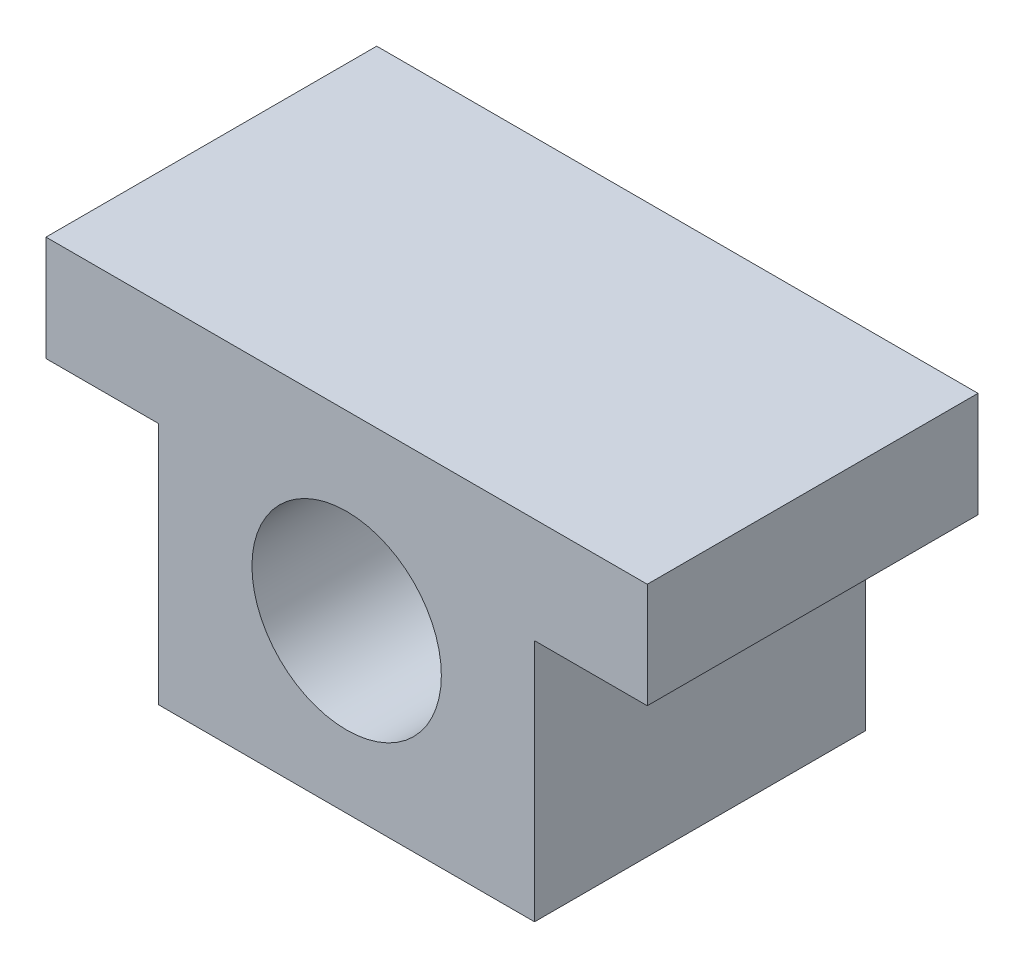
ISO-10303-21;
HEADER;
FILE_DESCRIPTION(('STEP AP214'),'2;1');
FILE_NAME('part.step','',(''),(''),'','','');
FILE_SCHEMA(('AUTOMOTIVE_DESIGN { 1 0 10303 214 1 1 1 1 }'));
ENDSEC;
DATA;
#1=APPLICATION_CONTEXT('core data for automotive mechanical design processes');
#2=APPLICATION_PROTOCOL_DEFINITION('international standard','automotive_design',2000,#1);
#3=PRODUCT_CONTEXT('',#1,'mechanical');
#4=PRODUCT('Part','Part','',(#3));
#5=PRODUCT_RELATED_PRODUCT_CATEGORY('part','',(#4));
#6=PRODUCT_DEFINITION_FORMATION('','',#4);
#7=PRODUCT_DEFINITION_CONTEXT('part definition',#1,'design');
#8=PRODUCT_DEFINITION('design','',#6,#7);
#9=PRODUCT_DEFINITION_SHAPE('','',#8);
#10=(LENGTH_UNIT() NAMED_UNIT(*) SI_UNIT(.MILLI.,.METRE.));
#11=(NAMED_UNIT(*) PLANE_ANGLE_UNIT() SI_UNIT($,.RADIAN.));
#12=(NAMED_UNIT(*) SI_UNIT($,.STERADIAN.) SOLID_ANGLE_UNIT());
#13=UNCERTAINTY_MEASURE_WITH_UNIT(LENGTH_MEASURE(1.E-05),#10,'distance_accuracy_value','');
#14=(GEOMETRIC_REPRESENTATION_CONTEXT(3) GLOBAL_UNCERTAINTY_ASSIGNED_CONTEXT((#13)) GLOBAL_UNIT_ASSIGNED_CONTEXT((#10,
#11,#12)) REPRESENTATION_CONTEXT('',''));
#15=CARTESIAN_POINT('',(0.,0.,0.));
#16=DIRECTION('',(0.,0.,1.));
#17=DIRECTION('',(1.,0.,0.));
#18=AXIS2_PLACEMENT_3D('',#15,#16,#17);
#19=CARTESIAN_POINT('',(100.,-17.5,110.));
#20=DIRECTION('',(-1.,0.,0.));
#21=DIRECTION('',(0.,0.,1.));
#22=AXIS2_PLACEMENT_3D('',#19,#20,#21);
#23=PLANE('',#22);
#24=DIRECTION('',(0.,1.,0.));
#25=VECTOR('',#24,1.);
#26=CARTESIAN_POINT('',(100.,-17.5,0.));
#27=LINE('',#26,#25);
#28=CARTESIAN_POINT('',(100.,-17.5,0.));
#29=VERTEX_POINT('',#28);
#30=CARTESIAN_POINT('',(100.,17.5,0.));
#31=VERTEX_POINT('',#30);
#32=EDGE_CURVE('E144',#29,#31,#27,.T.);
#33=ORIENTED_EDGE('',*,*,#32,.T.);
#34=DIRECTION('',(0.,0.,-1.));
#35=VECTOR('',#34,1.);
#36=CARTESIAN_POINT('',(100.,17.5,110.));
#37=LINE('',#36,#35);
#38=CARTESIAN_POINT('',(100.,17.5,110.));
#39=VERTEX_POINT('',#38);
#40=EDGE_CURVE('E11',#39,#31,#37,.T.);
#41=ORIENTED_EDGE('',*,*,#40,.F.);
#42=DIRECTION('',(0.,1.,0.));
#43=VECTOR('',#42,1.);
#44=CARTESIAN_POINT('',(100.,-17.5,110.));
#45=LINE('',#44,#43);
#46=CARTESIAN_POINT('',(100.,-17.5,110.));
#47=VERTEX_POINT('',#46);
#48=EDGE_CURVE('E159',#47,#39,#45,.T.);
#49=ORIENTED_EDGE('',*,*,#48,.F.);
#50=DIRECTION('',(0.,0.,-1.));
#51=VECTOR('',#50,1.);
#52=CARTESIAN_POINT('',(100.,-17.5,110.));
#53=LINE('',#52,#51);
#54=EDGE_CURVE('E140',#47,#29,#53,.T.);
#55=ORIENTED_EDGE('',*,*,#54,.T.);
#56=EDGE_LOOP('',(#33,#41,#49,#55));
#57=FACE_BOUND('',#56,.T.);
#58=ADVANCED_FACE('F45',(#57),#23,.F.);
#59=CARTESIAN_POINT('',(-100.,17.5,110.));
#60=DIRECTION('',(0.,-1.,0.));
#61=DIRECTION('',(0.,0.,-1.));
#62=AXIS2_PLACEMENT_3D('',#59,#60,#61);
#63=PLANE('',#62);
#64=DIRECTION('',(-1.,0.,0.));
#65=VECTOR('',#64,1.);
#66=CARTESIAN_POINT('',(-100.,17.5,0.));
#67=LINE('',#66,#65);
#68=CARTESIAN_POINT('',(-100.,17.5,0.));
#69=VERTEX_POINT('',#68);
#70=EDGE_CURVE('E147',#31,#69,#67,.T.);
#71=ORIENTED_EDGE('',*,*,#70,.T.);
#72=DIRECTION('',(0.,0.,-1.));
#73=VECTOR('',#72,1.);
#74=CARTESIAN_POINT('',(-100.,17.5,110.));
#75=LINE('',#74,#73);
#76=CARTESIAN_POINT('',(-100.,17.5,110.));
#77=VERTEX_POINT('',#76);
#78=EDGE_CURVE('E53',#77,#69,#75,.T.);
#79=ORIENTED_EDGE('',*,*,#78,.F.);
#80=DIRECTION('',(-1.,0.,0.));
#81=VECTOR('',#80,1.);
#82=CARTESIAN_POINT('',(-100.,17.5,110.));
#83=LINE('',#82,#81);
#84=EDGE_CURVE('E105',#39,#77,#83,.T.);
#85=ORIENTED_EDGE('',*,*,#84,.F.);
#86=ORIENTED_EDGE('',*,*,#40,.T.);
#87=EDGE_LOOP('',(#71,#79,#85,#86));
#88=FACE_BOUND('',#87,.T.);
#89=ADVANCED_FACE('F282',(#88),#63,.F.);
#90=CARTESIAN_POINT('',(-100.,-17.5,110.));
#91=DIRECTION('',(1.,0.,0.));
#92=DIRECTION('',(0.,0.,-1.));
#93=AXIS2_PLACEMENT_3D('',#90,#91,#92);
#94=PLANE('',#93);
#95=DIRECTION('',(0.,-1.,0.));
#96=VECTOR('',#95,1.);
#97=CARTESIAN_POINT('',(-100.,-17.5,0.));
#98=LINE('',#97,#96);
#99=CARTESIAN_POINT('',(-100.,-17.5,0.));
#100=VERTEX_POINT('',#99);
#101=EDGE_CURVE('E150',#69,#100,#98,.T.);
#102=ORIENTED_EDGE('',*,*,#101,.T.);
#103=DIRECTION('',(0.,0.,-1.));
#104=VECTOR('',#103,1.);
#105=CARTESIAN_POINT('',(-100.,-17.5,110.));
#106=LINE('',#105,#104);
#107=CARTESIAN_POINT('',(-100.,-17.5,110.));
#108=VERTEX_POINT('',#107);
#109=EDGE_CURVE('E166',#108,#100,#106,.T.);
#110=ORIENTED_EDGE('',*,*,#109,.F.);
#111=DIRECTION('',(0.,-1.,0.));
#112=VECTOR('',#111,1.);
#113=CARTESIAN_POINT('',(-100.,-17.5,110.));
#114=LINE('',#113,#112);
#115=EDGE_CURVE('E174',#77,#108,#114,.T.);
#116=ORIENTED_EDGE('',*,*,#115,.F.);
#117=ORIENTED_EDGE('',*,*,#78,.T.);
#118=EDGE_LOOP('',(#102,#110,#116,#117));
#119=FACE_BOUND('',#118,.T.);
#120=ADVANCED_FACE('F172',(#119),#94,.F.);
#121=CARTESIAN_POINT('',(-100.,-17.5,110.));
#122=DIRECTION('',(0.,1.,0.));
#123=DIRECTION('',(0.,0.,1.));
#124=AXIS2_PLACEMENT_3D('',#121,#122,#123);
#125=PLANE('',#124);
#126=DIRECTION('',(1.,0.,0.));
#127=VECTOR('',#126,1.);
#128=CARTESIAN_POINT('',(-100.,-17.5,0.));
#129=LINE('',#128,#127);
#130=CARTESIAN_POINT('',(-62.5,-17.5,0.));
#131=VERTEX_POINT('',#130);
#132=EDGE_CURVE('E152',#100,#131,#129,.T.);
#133=ORIENTED_EDGE('',*,*,#132,.T.);
#134=DIRECTION('',(0.,0.,-1.));
#135=VECTOR('',#134,1.);
#136=CARTESIAN_POINT('',(-62.5,-17.5,110.));
#137=LINE('',#136,#135);
#138=CARTESIAN_POINT('',(-62.5,-17.5,110.));
#139=VERTEX_POINT('',#138);
#140=EDGE_CURVE('E163',#139,#131,#137,.T.);
#141=ORIENTED_EDGE('',*,*,#140,.F.);
#142=DIRECTION('',(1.,0.,0.));
#143=VECTOR('',#142,1.);
#144=CARTESIAN_POINT('',(-100.,-17.5,110.));
#145=LINE('',#144,#143);
#146=EDGE_CURVE('E186',#108,#139,#145,.T.);
#147=ORIENTED_EDGE('',*,*,#146,.F.);
#148=ORIENTED_EDGE('',*,*,#109,.T.);
#149=EDGE_LOOP('',(#133,#141,#147,#148));
#150=FACE_BOUND('',#149,.T.);
#151=ADVANCED_FACE('F182',(#150),#125,.F.);
#152=CARTESIAN_POINT('',(-62.5,-17.5,110.));
#153=DIRECTION('',(1.,0.,0.));
#154=DIRECTION('',(0.,1.,0.));
#155=AXIS2_PLACEMENT_3D('',#152,#153,#154);
#156=PLANE('',#155);
#157=DIRECTION('',(0.,-1.,0.));
#158=VECTOR('',#157,1.);
#159=CARTESIAN_POINT('',(-62.5,-17.5,0.));
#160=LINE('',#159,#158);
#161=CARTESIAN_POINT('',(-62.5,-98.5,0.));
#162=VERTEX_POINT('',#161);
#163=EDGE_CURVE('E154',#131,#162,#160,.T.);
#164=ORIENTED_EDGE('',*,*,#163,.T.);
#165=DIRECTION('',(0.,0.,-1.));
#166=VECTOR('',#165,1.);
#167=CARTESIAN_POINT('',(-62.5,-98.5,110.));
#168=LINE('',#167,#166);
#169=CARTESIAN_POINT('',(-62.5,-98.5,110.));
#170=VERTEX_POINT('',#169);
#171=EDGE_CURVE('E135',#170,#162,#168,.T.);
#172=ORIENTED_EDGE('',*,*,#171,.F.);
#173=DIRECTION('',(0.,-1.,0.));
#174=VECTOR('',#173,1.);
#175=CARTESIAN_POINT('',(-62.5,-17.5,110.));
#176=LINE('',#175,#174);
#177=EDGE_CURVE('E126',#139,#170,#176,.T.);
#178=ORIENTED_EDGE('',*,*,#177,.F.);
#179=ORIENTED_EDGE('',*,*,#140,.T.);
#180=EDGE_LOOP('',(#164,#172,#178,#179));
#181=FACE_BOUND('',#180,.T.);
#182=ADVANCED_FACE('F185',(#181),#156,.F.);
#183=CARTESIAN_POINT('',(-62.5,-98.5,110.));
#184=DIRECTION('',(0.,1.,0.));
#185=DIRECTION('',(-1.,0.,0.));
#186=AXIS2_PLACEMENT_3D('',#183,#184,#185);
#187=PLANE('',#186);
#188=DIRECTION('',(1.,0.,0.));
#189=VECTOR('',#188,1.);
#190=CARTESIAN_POINT('',(-62.5,-98.5,0.));
#191=LINE('',#190,#189);
#192=CARTESIAN_POINT('',(62.5,-98.5,0.));
#193=VERTEX_POINT('',#192);
#194=EDGE_CURVE('E134',#162,#193,#191,.T.);
#195=ORIENTED_EDGE('',*,*,#194,.T.);
#196=DIRECTION('',(0.,0.,-1.));
#197=VECTOR('',#196,1.);
#198=CARTESIAN_POINT('',(62.5,-98.5,110.));
#199=LINE('',#198,#197);
#200=CARTESIAN_POINT('',(62.5,-98.5,110.));
#201=VERTEX_POINT('',#200);
#202=EDGE_CURVE('E131',#201,#193,#199,.T.);
#203=ORIENTED_EDGE('',*,*,#202,.F.);
#204=DIRECTION('',(1.,0.,0.));
#205=VECTOR('',#204,1.);
#206=CARTESIAN_POINT('',(-62.5,-98.5,110.));
#207=LINE('',#206,#205);
#208=EDGE_CURVE('E120',#170,#201,#207,.T.);
#209=ORIENTED_EDGE('',*,*,#208,.F.);
#210=ORIENTED_EDGE('',*,*,#171,.T.);
#211=EDGE_LOOP('',(#195,#203,#209,#210));
#212=FACE_BOUND('',#211,.T.);
#213=ADVANCED_FACE('F132',(#212),#187,.F.);
#214=CARTESIAN_POINT('',(62.4999999999999,-17.5,110.));
#215=DIRECTION('',(-1.,0.,0.));
#216=DIRECTION('',(0.,-1.,0.));
#217=AXIS2_PLACEMENT_3D('',#214,#215,#216);
#218=PLANE('',#217);
#219=DIRECTION('',(0.,1.,0.));
#220=VECTOR('',#219,1.);
#221=CARTESIAN_POINT('',(62.4999999999999,-17.5,0.));
#222=LINE('',#221,#220);
#223=CARTESIAN_POINT('',(62.4999999999999,-17.5,0.));
#224=VERTEX_POINT('',#223);
#225=EDGE_CURVE('E91',#193,#224,#222,.T.);
#226=ORIENTED_EDGE('',*,*,#225,.T.);
#227=DIRECTION('',(0.,0.,-1.));
#228=VECTOR('',#227,1.);
#229=CARTESIAN_POINT('',(62.4999999999999,-17.5,110.));
#230=LINE('',#229,#228);
#231=CARTESIAN_POINT('',(62.4999999999999,-17.5,110.));
#232=VERTEX_POINT('',#231);
#233=EDGE_CURVE('E136',#232,#224,#230,.T.);
#234=ORIENTED_EDGE('',*,*,#233,.F.);
#235=DIRECTION('',(0.,1.,0.));
#236=VECTOR('',#235,1.);
#237=CARTESIAN_POINT('',(62.4999999999999,-17.5,110.));
#238=LINE('',#237,#236);
#239=EDGE_CURVE('E124',#201,#232,#238,.T.);
#240=ORIENTED_EDGE('',*,*,#239,.F.);
#241=ORIENTED_EDGE('',*,*,#202,.T.);
#242=EDGE_LOOP('',(#226,#234,#240,#241));
#243=FACE_BOUND('',#242,.T.);
#244=ADVANCED_FACE('F138',(#243),#218,.F.);
#245=CARTESIAN_POINT('',(62.4999999999999,-17.5,110.));
#246=DIRECTION('',(0.,1.,0.));
#247=DIRECTION('',(0.,0.,1.));
#248=AXIS2_PLACEMENT_3D('',#245,#246,#247);
#249=PLANE('',#248);
#250=DIRECTION('',(1.,0.,0.));
#251=VECTOR('',#250,1.);
#252=CARTESIAN_POINT('',(62.4999999999999,-17.5,0.));
#253=LINE('',#252,#251);
#254=EDGE_CURVE('E97',#224,#29,#253,.T.);
#255=ORIENTED_EDGE('',*,*,#254,.T.);
#256=ORIENTED_EDGE('',*,*,#54,.F.);
#257=DIRECTION('',(1.,0.,0.));
#258=VECTOR('',#257,1.);
#259=CARTESIAN_POINT('',(62.4999999999999,-17.5,110.));
#260=LINE('',#259,#258);
#261=EDGE_CURVE('E61',#232,#47,#260,.T.);
#262=ORIENTED_EDGE('',*,*,#261,.F.);
#263=ORIENTED_EDGE('',*,*,#233,.T.);
#264=EDGE_LOOP('',(#255,#256,#262,#263));
#265=FACE_BOUND('',#264,.T.);
#266=ADVANCED_FACE('F275',(#265),#249,.F.);
#267=CARTESIAN_POINT('',(0.,0.,110.));
#268=DIRECTION('',(0.,0.,-1.));
#269=DIRECTION('',(-1.,0.,0.));
#270=AXIS2_PLACEMENT_3D('',#267,#268,#269);
#271=PLANE('',#270);
#272=CARTESIAN_POINT('',(0.,-43.,110.));
#273=DIRECTION('',(0.,0.,-1.));
#274=DIRECTION('',(-1.,0.,0.));
#275=AXIS2_PLACEMENT_3D('',#272,#273,#274);
#276=CIRCLE('',#275,31.5);
#277=CARTESIAN_POINT('',(-31.5,-43.,110.));
#278=VERTEX_POINT('',#277);
#279=EDGE_CURVE('E148',#278,#278,#276,.F.);
#280=ORIENTED_EDGE('',*,*,#279,.F.);
#281=EDGE_LOOP('',(#280));
#282=FACE_BOUND('',#281,.T.);
#283=ORIENTED_EDGE('',*,*,#48,.T.);
#284=ORIENTED_EDGE('',*,*,#84,.T.);
#285=ORIENTED_EDGE('',*,*,#115,.T.);
#286=ORIENTED_EDGE('',*,*,#146,.T.);
#287=ORIENTED_EDGE('',*,*,#177,.T.);
#288=ORIENTED_EDGE('',*,*,#208,.T.);
#289=ORIENTED_EDGE('',*,*,#239,.T.);
#290=ORIENTED_EDGE('',*,*,#261,.T.);
#291=EDGE_LOOP('',(#283,#284,#285,#286,#287,#288,#289,#290));
#292=FACE_BOUND('',#291,.T.);
#293=ADVANCED_FACE('F122',(#282,#292),#271,.F.);
#294=CARTESIAN_POINT('',(0.,0.,0.));
#295=DIRECTION('',(0.,0.,-1.));
#296=DIRECTION('',(-1.,0.,0.));
#297=AXIS2_PLACEMENT_3D('',#294,#295,#296);
#298=PLANE('',#297);
#299=CARTESIAN_POINT('',(32.8809306437636,-75.8800000000001,0.));
#300=DIRECTION('',(0.,0.,-1.));
#301=DIRECTION('',(-1.,0.,0.));
#302=AXIS2_PLACEMENT_3D('',#299,#300,#301);
#303=CIRCLE('',#302,4.25);
#304=CARTESIAN_POINT('',(28.6309306437636,-75.8800000000001,0.));
#305=VERTEX_POINT('',#304);
#306=EDGE_CURVE('E242',#305,#305,#303,.T.);
#307=ORIENTED_EDGE('',*,*,#306,.F.);
#308=EDGE_LOOP('',(#307));
#309=FACE_BOUND('',#308,.T.);
#310=CARTESIAN_POINT('',(44.9157212375736,-55.0344499545506,0.));
#311=DIRECTION('',(0.,0.,-1.));
#312=DIRECTION('',(-1.,0.,0.));
#313=AXIS2_PLACEMENT_3D('',#310,#311,#312);
#314=CIRCLE('',#313,4.25);
#315=CARTESIAN_POINT('',(40.6657212375736,-55.0344499545506,0.));
#316=VERTEX_POINT('',#315);
#317=EDGE_CURVE('E236',#316,#316,#314,.T.);
#318=ORIENTED_EDGE('',*,*,#317,.F.);
#319=EDGE_LOOP('',(#318));
#320=FACE_BOUND('',#319,.T.);
#321=CARTESIAN_POINT('',(44.9153805983142,-30.9642787624264,0.));
#322=DIRECTION('',(0.,0.,-1.));
#323=DIRECTION('',(-1.,0.,0.));
#324=AXIS2_PLACEMENT_3D('',#321,#322,#323);
#325=CIRCLE('',#324,4.25);
#326=CARTESIAN_POINT('',(40.6653805983142,-30.9642787624264,0.));
#327=VERTEX_POINT('',#326);
#328=EDGE_CURVE('E230',#327,#327,#325,.T.);
#329=ORIENTED_EDGE('',*,*,#328,.F.);
#330=EDGE_LOOP('',(#329));
#331=FACE_BOUND('',#330,.T.);
#332=CARTESIAN_POINT('',(32.88,-10.1190693562363,0.));
#333=DIRECTION('',(0.,0.,-1.));
#334=DIRECTION('',(-1.,0.,0.));
#335=AXIS2_PLACEMENT_3D('',#332,#333,#334);
#336=CIRCLE('',#335,4.25);
#337=CARTESIAN_POINT('',(28.63,-10.1190693562363,0.));
#338=VERTEX_POINT('',#337);
#339=EDGE_CURVE('E224',#338,#338,#336,.T.);
#340=ORIENTED_EDGE('',*,*,#339,.F.);
#341=EDGE_LOOP('',(#340));
#342=FACE_BOUND('',#341,.T.);
#343=CARTESIAN_POINT('',(-32.8809306437636,-75.8800000000001,0.));
#344=DIRECTION('',(0.,0.,-1.));
#345=DIRECTION('',(-1.,0.,0.));
#346=AXIS2_PLACEMENT_3D('',#343,#344,#345);
#347=CIRCLE('',#346,4.25);
#348=CARTESIAN_POINT('',(-37.1309306437636,-75.8800000000001,0.));
#349=VERTEX_POINT('',#348);
#350=EDGE_CURVE('E218',#349,#349,#347,.T.);
#351=ORIENTED_EDGE('',*,*,#350,.F.);
#352=EDGE_LOOP('',(#351));
#353=FACE_BOUND('',#352,.T.);
#354=CARTESIAN_POINT('',(-44.9157212375736,-55.0344499545506,0.));
#355=DIRECTION('',(0.,0.,-1.));
#356=DIRECTION('',(-1.,0.,0.));
#357=AXIS2_PLACEMENT_3D('',#354,#355,#356);
#358=CIRCLE('',#357,4.25);
#359=CARTESIAN_POINT('',(-49.1657212375736,-55.0344499545506,0.));
#360=VERTEX_POINT('',#359);
#361=EDGE_CURVE('E212',#360,#360,#358,.T.);
#362=ORIENTED_EDGE('',*,*,#361,.F.);
#363=EDGE_LOOP('',(#362));
#364=FACE_BOUND('',#363,.T.);
#365=CARTESIAN_POINT('',(-44.9153805983142,-30.9642787624264,0.));
#366=DIRECTION('',(0.,0.,-1.));
#367=DIRECTION('',(-1.,0.,0.));
#368=AXIS2_PLACEMENT_3D('',#365,#366,#367);
#369=CIRCLE('',#368,4.25);
#370=CARTESIAN_POINT('',(-49.1653805983142,-30.9642787624264,0.));
#371=VERTEX_POINT('',#370);
#372=EDGE_CURVE('E206',#371,#371,#369,.T.);
#373=ORIENTED_EDGE('',*,*,#372,.F.);
#374=EDGE_LOOP('',(#373));
#375=FACE_BOUND('',#374,.T.);
#376=CARTESIAN_POINT('',(-32.88,-10.1190693562363,0.));
#377=DIRECTION('',(0.,0.,-1.));
#378=DIRECTION('',(-1.,0.,0.));
#379=AXIS2_PLACEMENT_3D('',#376,#377,#378);
#380=CIRCLE('',#379,4.25);
#381=CARTESIAN_POINT('',(-37.13,-10.1190693562363,0.));
#382=VERTEX_POINT('',#381);
#383=EDGE_CURVE('E200',#382,#382,#380,.T.);
#384=ORIENTED_EDGE('',*,*,#383,.F.);
#385=EDGE_LOOP('',(#384));
#386=FACE_BOUND('',#385,.T.);
#387=CARTESIAN_POINT('',(0.,-43.,0.));
#388=DIRECTION('',(0.,0.,-1.));
#389=DIRECTION('',(-1.,0.,0.));
#390=AXIS2_PLACEMENT_3D('',#387,#388,#389);
#391=CIRCLE('',#390,31.5);
#392=CARTESIAN_POINT('',(-31.5,-43.,0.));
#393=VERTEX_POINT('',#392);
#394=EDGE_CURVE('E194',#393,#393,#391,.T.);
#395=ORIENTED_EDGE('',*,*,#394,.F.);
#396=EDGE_LOOP('',(#395));
#397=FACE_BOUND('',#396,.T.);
#398=ORIENTED_EDGE('',*,*,#32,.F.);
#399=ORIENTED_EDGE('',*,*,#254,.F.);
#400=ORIENTED_EDGE('',*,*,#225,.F.);
#401=ORIENTED_EDGE('',*,*,#194,.F.);
#402=ORIENTED_EDGE('',*,*,#163,.F.);
#403=ORIENTED_EDGE('',*,*,#132,.F.);
#404=ORIENTED_EDGE('',*,*,#101,.F.);
#405=ORIENTED_EDGE('',*,*,#70,.F.);
#406=EDGE_LOOP('',(#398,#399,#400,#401,#402,#403,#404,#405));
#407=FACE_BOUND('',#406,.T.);
#408=ADVANCED_FACE('F178',(#309,#320,#331,#342,#353,#364,#375,#386,#397,#407),#298,.T.);
#409=CARTESIAN_POINT('',(0.,-43.,110.001));
#410=DIRECTION('',(0.,0.,-1.));
#411=DIRECTION('',(-1.,0.,0.));
#412=AXIS2_PLACEMENT_3D('',#409,#410,#411);
#413=CYLINDRICAL_SURFACE('',#412,31.5);
#414=CARTESIAN_POINT('',(-31.5,-43.,0.));
#415=CARTESIAN_POINT('',(-31.5,-43.,1.14583333333333));
#416=CARTESIAN_POINT('',(-31.5,-43.,2.29166666666666));
#417=CARTESIAN_POINT('',(-31.5,-43.,4.58333333333333));
#418=CARTESIAN_POINT('',(-31.5,-43.,5.72916666666667));
#419=CARTESIAN_POINT('',(-31.5,-43.,8.02083333333334));
#420=CARTESIAN_POINT('',(-31.5,-43.,9.16666666666667));
#421=CARTESIAN_POINT('',(-31.5,-43.,11.4583333333333));
#422=CARTESIAN_POINT('',(-31.5,-43.,12.6041666666667));
#423=CARTESIAN_POINT('',(-31.5,-43.,14.8958333333333));
#424=CARTESIAN_POINT('',(-31.5,-43.,16.0416666666667));
#425=CARTESIAN_POINT('',(-31.5,-43.,18.3333333333333));
#426=CARTESIAN_POINT('',(-31.5,-43.,19.4791666666667));
#427=CARTESIAN_POINT('',(-31.5,-43.,21.7708333333333));
#428=CARTESIAN_POINT('',(-31.5,-43.,22.9166666666667));
#429=CARTESIAN_POINT('',(-31.5,-43.,25.2083333333333));
#430=CARTESIAN_POINT('',(-31.5,-43.,26.3541666666667));
#431=CARTESIAN_POINT('',(-31.5,-43.,28.6458333333333));
#432=CARTESIAN_POINT('',(-31.5,-43.,29.7916666666667));
#433=CARTESIAN_POINT('',(-31.5,-43.,32.0833333333333));
#434=CARTESIAN_POINT('',(-31.5,-43.,33.2291666666667));
#435=CARTESIAN_POINT('',(-31.5,-43.,35.5208333333333));
#436=CARTESIAN_POINT('',(-31.5,-43.,36.6666666666667));
#437=CARTESIAN_POINT('',(-31.5,-43.,38.9583333333333));
#438=CARTESIAN_POINT('',(-31.5,-43.,40.1041666666667));
#439=CARTESIAN_POINT('',(-31.5,-43.,42.3958333333333));
#440=CARTESIAN_POINT('',(-31.5,-43.,43.5416666666667));
#441=CARTESIAN_POINT('',(-31.5,-43.,45.8333333333333));
#442=CARTESIAN_POINT('',(-31.5,-43.,46.9791666666667));
#443=CARTESIAN_POINT('',(-31.5,-43.,49.2708333333333));
#444=CARTESIAN_POINT('',(-31.5,-43.,50.4166666666667));
#445=CARTESIAN_POINT('',(-31.5,-43.,52.7083333333333));
#446=CARTESIAN_POINT('',(-31.5,-43.,53.8541666666667));
#447=CARTESIAN_POINT('',(-31.5,-43.,56.1458333333333));
#448=CARTESIAN_POINT('',(-31.5,-43.,57.2916666666667));
#449=CARTESIAN_POINT('',(-31.5,-43.,59.5833333333333));
#450=CARTESIAN_POINT('',(-31.5,-43.,60.7291666666667));
#451=CARTESIAN_POINT('',(-31.5,-43.,63.0208333333333));
#452=CARTESIAN_POINT('',(-31.5,-43.,64.1666666666667));
#453=CARTESIAN_POINT('',(-31.5,-43.,66.4583333333333));
#454=CARTESIAN_POINT('',(-31.5,-43.,67.6041666666667));
#455=CARTESIAN_POINT('',(-31.5,-43.,69.8958333333333));
#456=CARTESIAN_POINT('',(-31.5,-43.,71.0416666666667));
#457=CARTESIAN_POINT('',(-31.5,-43.,73.3333333333333));
#458=CARTESIAN_POINT('',(-31.5,-43.,74.4791666666667));
#459=CARTESIAN_POINT('',(-31.5,-43.,76.7708333333333));
#460=CARTESIAN_POINT('',(-31.5,-43.,77.9166666666667));
#461=CARTESIAN_POINT('',(-31.5,-43.,80.2083333333333));
#462=CARTESIAN_POINT('',(-31.5,-43.,81.3541666666667));
#463=CARTESIAN_POINT('',(-31.5,-43.,83.6458333333333));
#464=CARTESIAN_POINT('',(-31.5,-43.,84.7916666666667));
#465=CARTESIAN_POINT('',(-31.5,-43.,87.0833333333333));
#466=CARTESIAN_POINT('',(-31.5,-43.,88.2291666666667));
#467=CARTESIAN_POINT('',(-31.5,-43.,90.5208333333333));
#468=CARTESIAN_POINT('',(-31.5,-43.,91.6666666666667));
#469=CARTESIAN_POINT('',(-31.5,-43.,93.9583333333333));
#470=CARTESIAN_POINT('',(-31.5,-43.,95.1041666666667));
#471=CARTESIAN_POINT('',(-31.5,-43.,97.3958333333333));
#472=CARTESIAN_POINT('',(-31.5,-43.,98.5416666666667));
#473=CARTESIAN_POINT('',(-31.5,-43.,100.833333333333));
#474=CARTESIAN_POINT('',(-31.5,-43.,101.979166666667));
#475=CARTESIAN_POINT('',(-31.5,-43.,104.270833333333));
#476=CARTESIAN_POINT('',(-31.5,-43.,105.416666666667));
#477=CARTESIAN_POINT('',(-31.5,-43.,107.708333333333));
#478=CARTESIAN_POINT('',(-31.5,-43.,108.854166666667));
#479=CARTESIAN_POINT('',(-31.5,-43.,110.));
#480=B_SPLINE_CURVE_WITH_KNOTS('',3,(#414,#415,#416,#417,#418,#419,#420,#421,#422,#423,#424,
#425,#426,#427,#428,#429,#430,#431,#432,#433,#434,#435,#436,#437,#438,#439,#440,#441,#442,#443,
#444,#445,#446,#447,#448,#449,#450,#451,#452,#453,#454,#455,#456,#457,#458,#459,#460,#461,#462,
#463,#464,#465,#466,#467,#468,#469,#470,#471,#472,#473,#474,#475,#476,#477,#478,#479),
.UNSPECIFIED.,.F.,.F.,(4,2,2,2,2,2,2,2,2,2,2,2,2,2,2,2,2,2,2,2,2,2,2,2,2,2,2,2,2,2,2,2,4),(0.,
3.4375,6.87500000000001,10.3125,13.75,17.1875,20.625,24.0625,27.5,30.9375,34.375,37.8125,41.25,
44.6875,48.125,51.5625,55.,58.4375,61.875,65.3125,68.75,72.1875,75.625,79.0625,82.5,85.9375,
89.375,92.8125,96.25,99.6875,103.125,106.5625,110.),.UNSPECIFIED.);
#481=EDGE_CURVE('BSEAM250',#393,#278,#480,.T.);
#482=ORIENTED_EDGE('',*,*,#394,.T.);
#483=ORIENTED_EDGE('',*,*,#279,.T.);
#484=ORIENTED_EDGE('',*,*,#481,.T.);
#485=ORIENTED_EDGE('',*,*,#481,.F.);
#486=EDGE_LOOP('',(#482,#484,#483,#485));
#487=FACE_BOUND('',#486,.T.);
#488=ADVANCED_FACE('F250',(#487),#413,.F.);
#489=CARTESIAN_POINT('',(-32.88,-10.1190693562363,27.4463423691329));
#490=DIRECTION('',(0.,0.,-1.));
#491=DIRECTION('',(-1.,0.,0.));
#492=AXIS2_PLACEMENT_3D('',#489,#490,#491);
#493=CONICAL_SURFACE('',#492,4.24999999999999,1.02974425867665);
#494=CARTESIAN_POINT('',(-32.88,-10.1190693562363,30.));
#495=VERTEX_POINT('',#494);
#496=VERTEX_LOOP('',#495);
#497=FACE_BOUND('',#496,.T.);
#498=CARTESIAN_POINT('',(-32.88,-10.1190693562363,27.4463423691329));
#499=DIRECTION('',(0.,0.,-1.));
#500=DIRECTION('',(-1.,0.,0.));
#501=AXIS2_PLACEMENT_3D('',#498,#499,#500);
#502=CIRCLE('',#501,4.24999999999999);
#503=CARTESIAN_POINT('',(-37.13,-10.1190693562363,27.4463423691329));
#504=VERTEX_POINT('',#503);
#505=EDGE_CURVE('E197',#504,#504,#502,.T.);
#506=ORIENTED_EDGE('',*,*,#505,.T.);
#507=EDGE_LOOP('',(#506));
#508=FACE_BOUND('',#507,.T.);
#509=ADVANCED_FACE('F270',(#497,#508),#493,.F.);
#510=CARTESIAN_POINT('',(-32.88,-10.1190693562363,0.));
#511=DIRECTION('',(0.,0.,-1.));
#512=DIRECTION('',(-1.,0.,0.));
#513=AXIS2_PLACEMENT_3D('',#510,#511,#512);
#514=CYLINDRICAL_SURFACE('',#513,4.24999999999999);
#515=ORIENTED_EDGE('',*,*,#505,.F.);
#516=EDGE_LOOP('',(#515));
#517=FACE_BOUND('',#516,.T.);
#518=ORIENTED_EDGE('',*,*,#383,.T.);
#519=EDGE_LOOP('',(#518));
#520=FACE_BOUND('',#519,.T.);
#521=ADVANCED_FACE('F338',(#517,#520),#514,.F.);
#522=CARTESIAN_POINT('',(-44.9153805983142,-30.9642787624264,27.4463423691329));
#523=DIRECTION('',(0.,0.,-1.));
#524=DIRECTION('',(-1.,0.,0.));
#525=AXIS2_PLACEMENT_3D('',#522,#523,#524);
#526=CONICAL_SURFACE('',#525,4.25,1.02974425867665);
#527=CARTESIAN_POINT('',(-44.9153805983142,-30.9642787624264,30.));
#528=VERTEX_POINT('',#527);
#529=VERTEX_LOOP('',#528);
#530=FACE_BOUND('',#529,.T.);
#531=CARTESIAN_POINT('',(-44.9153805983142,-30.9642787624264,27.4463423691329));
#532=DIRECTION('',(0.,0.,-1.));
#533=DIRECTION('',(-1.,0.,0.));
#534=AXIS2_PLACEMENT_3D('',#531,#532,#533);
#535=CIRCLE('',#534,4.25);
#536=CARTESIAN_POINT('',(-49.1653805983142,-30.9642787624264,27.4463423691329));
#537=VERTEX_POINT('',#536);
#538=EDGE_CURVE('E203',#537,#537,#535,.T.);
#539=ORIENTED_EDGE('',*,*,#538,.T.);
#540=EDGE_LOOP('',(#539));
#541=FACE_BOUND('',#540,.T.);
#542=ADVANCED_FACE('F349',(#530,#541),#526,.F.);
#543=CARTESIAN_POINT('',(-44.9153805983142,-30.9642787624264,0.));
#544=DIRECTION('',(0.,0.,-1.));
#545=DIRECTION('',(-1.,0.,0.));
#546=AXIS2_PLACEMENT_3D('',#543,#544,#545);
#547=CYLINDRICAL_SURFACE('',#546,4.25);
#548=ORIENTED_EDGE('',*,*,#538,.F.);
#549=EDGE_LOOP('',(#548));
#550=FACE_BOUND('',#549,.T.);
#551=ORIENTED_EDGE('',*,*,#372,.T.);
#552=EDGE_LOOP('',(#551));
#553=FACE_BOUND('',#552,.T.);
#554=ADVANCED_FACE('F360',(#550,#553),#547,.F.);
#555=CARTESIAN_POINT('',(-44.9157212375736,-55.0344499545506,27.4463423691329));
#556=DIRECTION('',(0.,0.,-1.));
#557=DIRECTION('',(-1.,0.,0.));
#558=AXIS2_PLACEMENT_3D('',#555,#556,#557);
#559=CONICAL_SURFACE('',#558,4.24999999999999,1.02974425867665);
#560=CARTESIAN_POINT('',(-44.9157212375736,-55.0344499545506,30.));
#561=VERTEX_POINT('',#560);
#562=VERTEX_LOOP('',#561);
#563=FACE_BOUND('',#562,.T.);
#564=CARTESIAN_POINT('',(-44.9157212375736,-55.0344499545506,27.4463423691329));
#565=DIRECTION('',(0.,0.,-1.));
#566=DIRECTION('',(-1.,0.,0.));
#567=AXIS2_PLACEMENT_3D('',#564,#565,#566);
#568=CIRCLE('',#567,4.24999999999999);
#569=CARTESIAN_POINT('',(-49.1657212375736,-55.0344499545506,27.4463423691329));
#570=VERTEX_POINT('',#569);
#571=EDGE_CURVE('E209',#570,#570,#568,.T.);
#572=ORIENTED_EDGE('',*,*,#571,.T.);
#573=EDGE_LOOP('',(#572));
#574=FACE_BOUND('',#573,.T.);
#575=ADVANCED_FACE('F371',(#563,#574),#559,.F.);
#576=CARTESIAN_POINT('',(-44.9157212375736,-55.0344499545506,0.));
#577=DIRECTION('',(0.,0.,-1.));
#578=DIRECTION('',(-1.,0.,0.));
#579=AXIS2_PLACEMENT_3D('',#576,#577,#578);
#580=CYLINDRICAL_SURFACE('',#579,4.24999999999999);
#581=ORIENTED_EDGE('',*,*,#571,.F.);
#582=EDGE_LOOP('',(#581));
#583=FACE_BOUND('',#582,.T.);
#584=ORIENTED_EDGE('',*,*,#361,.T.);
#585=EDGE_LOOP('',(#584));
#586=FACE_BOUND('',#585,.T.);
#587=ADVANCED_FACE('F382',(#583,#586),#580,.F.);
#588=CARTESIAN_POINT('',(-32.8809306437636,-75.8800000000001,27.4463423691329));
#589=DIRECTION('',(0.,0.,-1.));
#590=DIRECTION('',(-1.,0.,0.));
#591=AXIS2_PLACEMENT_3D('',#588,#589,#590);
#592=CONICAL_SURFACE('',#591,4.24999999999999,1.02974425867665);
#593=CARTESIAN_POINT('',(-32.8809306437636,-75.8800000000001,30.));
#594=VERTEX_POINT('',#593);
#595=VERTEX_LOOP('',#594);
#596=FACE_BOUND('',#595,.T.);
#597=CARTESIAN_POINT('',(-32.8809306437636,-75.8800000000001,27.4463423691329));
#598=DIRECTION('',(0.,0.,-1.));
#599=DIRECTION('',(-1.,0.,0.));
#600=AXIS2_PLACEMENT_3D('',#597,#598,#599);
#601=CIRCLE('',#600,4.24999999999999);
#602=CARTESIAN_POINT('',(-37.1309306437636,-75.8800000000001,27.4463423691329));
#603=VERTEX_POINT('',#602);
#604=EDGE_CURVE('E215',#603,#603,#601,.T.);
#605=ORIENTED_EDGE('',*,*,#604,.T.);
#606=EDGE_LOOP('',(#605));
#607=FACE_BOUND('',#606,.T.);
#608=ADVANCED_FACE('F393',(#596,#607),#592,.F.);
#609=CARTESIAN_POINT('',(-32.8809306437636,-75.8800000000001,0.));
#610=DIRECTION('',(0.,0.,-1.));
#611=DIRECTION('',(-1.,0.,0.));
#612=AXIS2_PLACEMENT_3D('',#609,#610,#611);
#613=CYLINDRICAL_SURFACE('',#612,4.24999999999999);
#614=ORIENTED_EDGE('',*,*,#604,.F.);
#615=EDGE_LOOP('',(#614));
#616=FACE_BOUND('',#615,.T.);
#617=ORIENTED_EDGE('',*,*,#350,.T.);
#618=EDGE_LOOP('',(#617));
#619=FACE_BOUND('',#618,.T.);
#620=ADVANCED_FACE('F404',(#616,#619),#613,.F.);
#621=CARTESIAN_POINT('',(32.88,-10.1190693562363,27.4463423691329));
#622=DIRECTION('',(0.,0.,-1.));
#623=DIRECTION('',(-1.,0.,0.));
#624=AXIS2_PLACEMENT_3D('',#621,#622,#623);
#625=CONICAL_SURFACE('',#624,4.25,1.02974425867665);
#626=CARTESIAN_POINT('',(32.88,-10.1190693562363,30.));
#627=VERTEX_POINT('',#626);
#628=VERTEX_LOOP('',#627);
#629=FACE_BOUND('',#628,.T.);
#630=CARTESIAN_POINT('',(32.88,-10.1190693562363,27.4463423691329));
#631=DIRECTION('',(0.,0.,-1.));
#632=DIRECTION('',(-1.,0.,0.));
#633=AXIS2_PLACEMENT_3D('',#630,#631,#632);
#634=CIRCLE('',#633,4.25);
#635=CARTESIAN_POINT('',(28.63,-10.1190693562363,27.4463423691329));
#636=VERTEX_POINT('',#635);
#637=EDGE_CURVE('E221',#636,#636,#634,.T.);
#638=ORIENTED_EDGE('',*,*,#637,.T.);
#639=EDGE_LOOP('',(#638));
#640=FACE_BOUND('',#639,.T.);
#641=ADVANCED_FACE('F414',(#629,#640),#625,.F.);
#642=CARTESIAN_POINT('',(32.88,-10.1190693562363,0.));
#643=DIRECTION('',(0.,0.,-1.));
#644=DIRECTION('',(-1.,0.,0.));
#645=AXIS2_PLACEMENT_3D('',#642,#643,#644);
#646=CYLINDRICAL_SURFACE('',#645,4.25);
#647=ORIENTED_EDGE('',*,*,#637,.F.);
#648=EDGE_LOOP('',(#647));
#649=FACE_BOUND('',#648,.T.);
#650=ORIENTED_EDGE('',*,*,#339,.T.);
#651=EDGE_LOOP('',(#650));
#652=FACE_BOUND('',#651,.T.);
#653=ADVANCED_FACE('F424',(#649,#652),#646,.F.);
#654=CARTESIAN_POINT('',(44.9153805983142,-30.9642787624264,27.4463423691329));
#655=DIRECTION('',(0.,0.,-1.));
#656=DIRECTION('',(-1.,0.,0.));
#657=AXIS2_PLACEMENT_3D('',#654,#655,#656);
#658=CONICAL_SURFACE('',#657,4.25,1.02974425867665);
#659=CARTESIAN_POINT('',(44.9153805983142,-30.9642787624264,30.));
#660=VERTEX_POINT('',#659);
#661=VERTEX_LOOP('',#660);
#662=FACE_BOUND('',#661,.T.);
#663=CARTESIAN_POINT('',(44.9153805983142,-30.9642787624264,27.4463423691329));
#664=DIRECTION('',(0.,0.,-1.));
#665=DIRECTION('',(-1.,0.,0.));
#666=AXIS2_PLACEMENT_3D('',#663,#664,#665);
#667=CIRCLE('',#666,4.25);
#668=CARTESIAN_POINT('',(40.6653805983142,-30.9642787624264,27.4463423691329));
#669=VERTEX_POINT('',#668);
#670=EDGE_CURVE('E227',#669,#669,#667,.T.);
#671=ORIENTED_EDGE('',*,*,#670,.T.);
#672=EDGE_LOOP('',(#671));
#673=FACE_BOUND('',#672,.T.);
#674=ADVANCED_FACE('F435',(#662,#673),#658,.F.);
#675=CARTESIAN_POINT('',(44.9153805983142,-30.9642787624264,0.));
#676=DIRECTION('',(0.,0.,-1.));
#677=DIRECTION('',(-1.,0.,0.));
#678=AXIS2_PLACEMENT_3D('',#675,#676,#677);
#679=CYLINDRICAL_SURFACE('',#678,4.25);
#680=ORIENTED_EDGE('',*,*,#670,.F.);
#681=EDGE_LOOP('',(#680));
#682=FACE_BOUND('',#681,.T.);
#683=ORIENTED_EDGE('',*,*,#328,.T.);
#684=EDGE_LOOP('',(#683));
#685=FACE_BOUND('',#684,.T.);
#686=ADVANCED_FACE('F446',(#682,#685),#679,.F.);
#687=CARTESIAN_POINT('',(44.9157212375736,-55.0344499545506,27.4463423691329));
#688=DIRECTION('',(0.,0.,-1.));
#689=DIRECTION('',(-1.,0.,0.));
#690=AXIS2_PLACEMENT_3D('',#687,#688,#689);
#691=CONICAL_SURFACE('',#690,4.24999999999999,1.02974425867665);
#692=CARTESIAN_POINT('',(44.9157212375736,-55.0344499545506,30.));
#693=VERTEX_POINT('',#692);
#694=VERTEX_LOOP('',#693);
#695=FACE_BOUND('',#694,.T.);
#696=CARTESIAN_POINT('',(44.9157212375736,-55.0344499545506,27.4463423691329));
#697=DIRECTION('',(0.,0.,-1.));
#698=DIRECTION('',(-1.,0.,0.));
#699=AXIS2_PLACEMENT_3D('',#696,#697,#698);
#700=CIRCLE('',#699,4.24999999999999);
#701=CARTESIAN_POINT('',(40.6657212375736,-55.0344499545506,27.4463423691329));
#702=VERTEX_POINT('',#701);
#703=EDGE_CURVE('E233',#702,#702,#700,.T.);
#704=ORIENTED_EDGE('',*,*,#703,.T.);
#705=EDGE_LOOP('',(#704));
#706=FACE_BOUND('',#705,.T.);
#707=ADVANCED_FACE('F457',(#695,#706),#691,.F.);
#708=CARTESIAN_POINT('',(44.9157212375736,-55.0344499545506,0.));
#709=DIRECTION('',(0.,0.,-1.));
#710=DIRECTION('',(-1.,0.,0.));
#711=AXIS2_PLACEMENT_3D('',#708,#709,#710);
#712=CYLINDRICAL_SURFACE('',#711,4.24999999999999);
#713=ORIENTED_EDGE('',*,*,#703,.F.);
#714=EDGE_LOOP('',(#713));
#715=FACE_BOUND('',#714,.T.);
#716=ORIENTED_EDGE('',*,*,#317,.T.);
#717=EDGE_LOOP('',(#716));
#718=FACE_BOUND('',#717,.T.);
#719=ADVANCED_FACE('F468',(#715,#718),#712,.F.);
#720=CARTESIAN_POINT('',(32.8809306437636,-75.8800000000001,27.4463423691329));
#721=DIRECTION('',(0.,0.,-1.));
#722=DIRECTION('',(-1.,0.,0.));
#723=AXIS2_PLACEMENT_3D('',#720,#721,#722);
#724=CONICAL_SURFACE('',#723,4.24999999999999,1.02974425867665);
#725=CARTESIAN_POINT('',(32.8809306437636,-75.8800000000001,30.));
#726=VERTEX_POINT('',#725);
#727=VERTEX_LOOP('',#726);
#728=FACE_BOUND('',#727,.T.);
#729=CARTESIAN_POINT('',(32.8809306437636,-75.8800000000001,27.4463423691329));
#730=DIRECTION('',(0.,0.,-1.));
#731=DIRECTION('',(-1.,0.,0.));
#732=AXIS2_PLACEMENT_3D('',#729,#730,#731);
#733=CIRCLE('',#732,4.24999999999999);
#734=CARTESIAN_POINT('',(28.6309306437636,-75.8800000000001,27.4463423691329));
#735=VERTEX_POINT('',#734);
#736=EDGE_CURVE('E239',#735,#735,#733,.T.);
#737=ORIENTED_EDGE('',*,*,#736,.T.);
#738=EDGE_LOOP('',(#737));
#739=FACE_BOUND('',#738,.T.);
#740=ADVANCED_FACE('F479',(#728,#739),#724,.F.);
#741=CARTESIAN_POINT('',(32.8809306437636,-75.8800000000001,0.));
#742=DIRECTION('',(0.,0.,-1.));
#743=DIRECTION('',(-1.,0.,0.));
#744=AXIS2_PLACEMENT_3D('',#741,#742,#743);
#745=CYLINDRICAL_SURFACE('',#744,4.24999999999999);
#746=ORIENTED_EDGE('',*,*,#736,.F.);
#747=EDGE_LOOP('',(#746));
#748=FACE_BOUND('',#747,.T.);
#749=ORIENTED_EDGE('',*,*,#306,.T.);
#750=EDGE_LOOP('',(#749));
#751=FACE_BOUND('',#750,.T.);
#752=ADVANCED_FACE('F246',(#748,#751),#745,.F.);
#753=CLOSED_SHELL('',(#58,#89,#120,#151,#182,#213,#244,#266,#293,#408,#488,#509,#521,#542,#554,
#575,#587,#608,#620,#641,#653,#674,#686,#707,#719,#740,#752));
#754=MANIFOLD_SOLID_BREP('B2',#753);
#755=ADVANCED_BREP_SHAPE_REPRESENTATION('',(#18,#754),#14);
#756=SHAPE_DEFINITION_REPRESENTATION(#9,#755);
ENDSEC;
END-ISO-10303-21;
